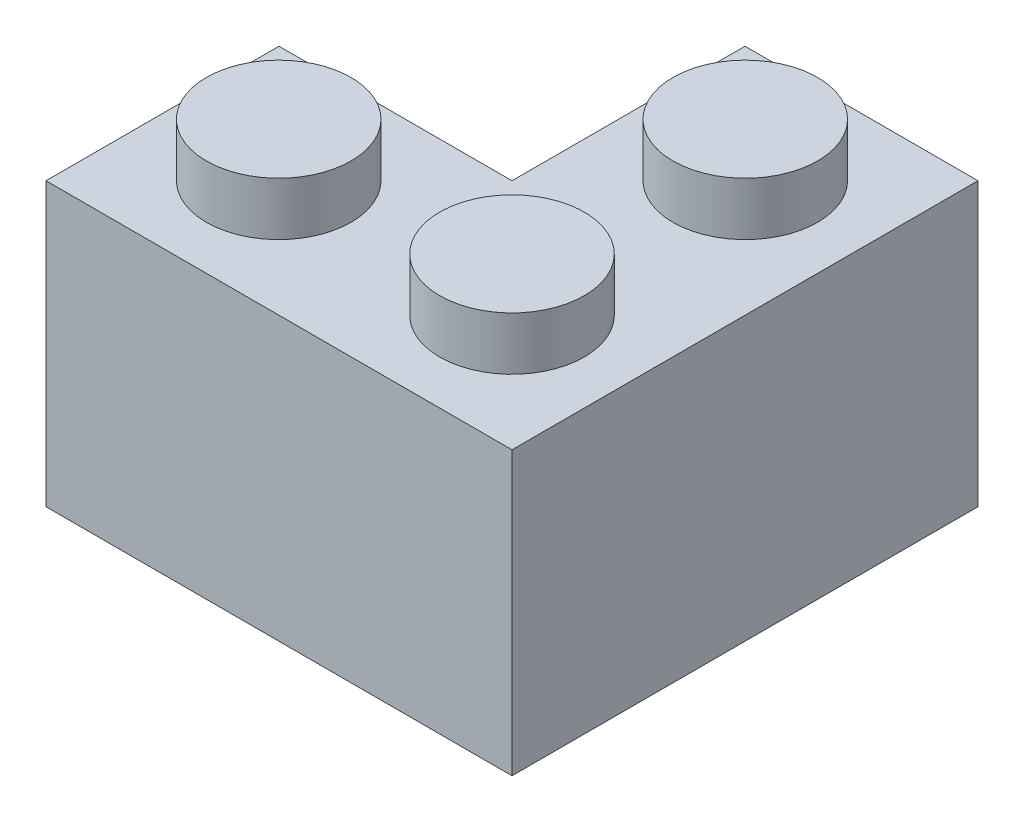
ISO-10303-21;
HEADER;
FILE_DESCRIPTION(('STEP AP214'),'2;1');
FILE_NAME('part.step','',(''),(''),'','','');
FILE_SCHEMA(('AUTOMOTIVE_DESIGN { 1 0 10303 214 1 1 1 1 }'));
ENDSEC;
DATA;
#1=APPLICATION_CONTEXT('core data for automotive mechanical design processes');
#2=APPLICATION_PROTOCOL_DEFINITION('international standard','automotive_design',2000,#1);
#3=PRODUCT_CONTEXT('',#1,'mechanical');
#4=PRODUCT('Part','Part','',(#3));
#5=PRODUCT_RELATED_PRODUCT_CATEGORY('part','',(#4));
#6=PRODUCT_DEFINITION_FORMATION('','',#4);
#7=PRODUCT_DEFINITION_CONTEXT('part definition',#1,'design');
#8=PRODUCT_DEFINITION('design','',#6,#7);
#9=PRODUCT_DEFINITION_SHAPE('','',#8);
#10=(LENGTH_UNIT() NAMED_UNIT(*) SI_UNIT(.MILLI.,.METRE.));
#11=(NAMED_UNIT(*) PLANE_ANGLE_UNIT() SI_UNIT($,.RADIAN.));
#12=(NAMED_UNIT(*) SI_UNIT($,.STERADIAN.) SOLID_ANGLE_UNIT());
#13=UNCERTAINTY_MEASURE_WITH_UNIT(LENGTH_MEASURE(1.E-05),#10,'distance_accuracy_value','');
#14=(GEOMETRIC_REPRESENTATION_CONTEXT(3) GLOBAL_UNCERTAINTY_ASSIGNED_CONTEXT((#13)) GLOBAL_UNIT_ASSIGNED_CONTEXT((#10,
#11,#12)) REPRESENTATION_CONTEXT('',''));
#15=CARTESIAN_POINT('',(0.,0.,0.));
#16=DIRECTION('',(0.,0.,1.));
#17=DIRECTION('',(1.,0.,0.));
#18=AXIS2_PLACEMENT_3D('',#15,#16,#17);
#19=CARTESIAN_POINT('',(-7.89,-9.56,0.));
#20=DIRECTION('',(0.,0.,-1.));
#21=DIRECTION('',(-1.,0.,0.));
#22=AXIS2_PLACEMENT_3D('',#19,#20,#21);
#23=PLANE('',#22);
#24=DIRECTION('',(-1.,0.,0.));
#25=VECTOR('',#24,1.);
#26=CARTESIAN_POINT('',(-7.89,0.,0.));
#27=LINE('',#26,#25);
#28=CARTESIAN_POINT('',(0.,0.,0.));
#29=VERTEX_POINT('',#28);
#30=CARTESIAN_POINT('',(-7.89,0.,0.));
#31=VERTEX_POINT('',#30);
#32=EDGE_CURVE('E135',#29,#31,#27,.T.);
#33=ORIENTED_EDGE('',*,*,#32,.F.);
#34=DIRECTION('',(0.,1.,0.));
#35=VECTOR('',#34,1.);
#36=CARTESIAN_POINT('',(0.,-9.56,0.));
#37=LINE('',#36,#35);
#38=CARTESIAN_POINT('',(0.,-9.56,0.));
#39=VERTEX_POINT('',#38);
#40=EDGE_CURVE('E58',#39,#29,#37,.T.);
#41=ORIENTED_EDGE('',*,*,#40,.F.);
#42=DIRECTION('',(-1.,0.,0.));
#43=VECTOR('',#42,1.);
#44=CARTESIAN_POINT('',(-7.89,-9.56,0.));
#45=LINE('',#44,#43);
#46=CARTESIAN_POINT('',(-7.89,-9.56,0.));
#47=VERTEX_POINT('',#46);
#48=EDGE_CURVE('E151',#39,#47,#45,.T.);
#49=ORIENTED_EDGE('',*,*,#48,.T.);
#50=DIRECTION('',(0.,1.,0.));
#51=VECTOR('',#50,1.);
#52=CARTESIAN_POINT('',(-7.89,-9.56,0.));
#53=LINE('',#52,#51);
#54=EDGE_CURVE('E91',#47,#31,#53,.T.);
#55=ORIENTED_EDGE('',*,*,#54,.T.);
#56=EDGE_LOOP('',(#33,#41,#49,#55));
#57=FACE_BOUND('',#56,.T.);
#58=ADVANCED_FACE('F35',(#57),#23,.T.);
#59=CARTESIAN_POINT('',(0.,-9.56,0.));
#60=DIRECTION('',(-1.,0.,0.));
#61=DIRECTION('',(0.,0.,1.));
#62=AXIS2_PLACEMENT_3D('',#59,#60,#61);
#63=PLANE('',#62);
#64=DIRECTION('',(0.,0.,1.));
#65=VECTOR('',#64,1.);
#66=CARTESIAN_POINT('',(0.,0.,0.));
#67=LINE('',#66,#65);
#68=CARTESIAN_POINT('',(0.,0.,-7.89));
#69=VERTEX_POINT('',#68);
#70=EDGE_CURVE('E148',#69,#29,#67,.T.);
#71=ORIENTED_EDGE('',*,*,#70,.F.);
#72=DIRECTION('',(0.,1.,0.));
#73=VECTOR('',#72,1.);
#74=CARTESIAN_POINT('',(0.,-9.56,-7.89));
#75=LINE('',#74,#73);
#76=CARTESIAN_POINT('',(0.,-9.56,-7.89));
#77=VERTEX_POINT('',#76);
#78=EDGE_CURVE('E116',#77,#69,#75,.T.);
#79=ORIENTED_EDGE('',*,*,#78,.F.);
#80=DIRECTION('',(0.,0.,1.));
#81=VECTOR('',#80,1.);
#82=CARTESIAN_POINT('',(0.,-9.56,0.));
#83=LINE('',#82,#81);
#84=EDGE_CURVE('E125',#77,#39,#83,.T.);
#85=ORIENTED_EDGE('',*,*,#84,.T.);
#86=ORIENTED_EDGE('',*,*,#40,.T.);
#87=EDGE_LOOP('',(#71,#79,#85,#86));
#88=FACE_BOUND('',#87,.T.);
#89=ADVANCED_FACE('F283',(#88),#63,.T.);
#90=CARTESIAN_POINT('',(0.,-9.56,-7.89));
#91=DIRECTION('',(0.,0.,-1.));
#92=DIRECTION('',(-1.,0.,0.));
#93=AXIS2_PLACEMENT_3D('',#90,#91,#92);
#94=PLANE('',#93);
#95=DIRECTION('',(-1.,0.,0.));
#96=VECTOR('',#95,1.);
#97=CARTESIAN_POINT('',(0.,0.,-7.89));
#98=LINE('',#97,#96);
#99=CARTESIAN_POINT('',(7.89,0.,-7.89));
#100=VERTEX_POINT('',#99);
#101=EDGE_CURVE('E111',#100,#69,#98,.T.);
#102=ORIENTED_EDGE('',*,*,#101,.F.);
#103=DIRECTION('',(0.,1.,0.));
#104=VECTOR('',#103,1.);
#105=CARTESIAN_POINT('',(7.89,-9.56,-7.89));
#106=LINE('',#105,#104);
#107=CARTESIAN_POINT('',(7.89,-9.56,-7.89));
#108=VERTEX_POINT('',#107);
#109=EDGE_CURVE('E105',#108,#100,#106,.T.);
#110=ORIENTED_EDGE('',*,*,#109,.F.);
#111=DIRECTION('',(-1.,0.,0.));
#112=VECTOR('',#111,1.);
#113=CARTESIAN_POINT('',(0.,-9.56,-7.89));
#114=LINE('',#113,#112);
#115=EDGE_CURVE('E108',#108,#77,#114,.T.);
#116=ORIENTED_EDGE('',*,*,#115,.T.);
#117=ORIENTED_EDGE('',*,*,#78,.T.);
#118=EDGE_LOOP('',(#102,#110,#116,#117));
#119=FACE_BOUND('',#118,.T.);
#120=ADVANCED_FACE('F107',(#119),#94,.T.);
#121=CARTESIAN_POINT('',(7.89,-9.56,-7.89));
#122=DIRECTION('',(1.,0.,0.));
#123=DIRECTION('',(0.,0.,-1.));
#124=AXIS2_PLACEMENT_3D('',#121,#122,#123);
#125=PLANE('',#124);
#126=DIRECTION('',(0.,0.,-1.));
#127=VECTOR('',#126,1.);
#128=CARTESIAN_POINT('',(7.89,0.,-7.89));
#129=LINE('',#128,#127);
#130=CARTESIAN_POINT('',(7.89,0.,7.89));
#131=VERTEX_POINT('',#130);
#132=EDGE_CURVE('E145',#131,#100,#129,.T.);
#133=ORIENTED_EDGE('',*,*,#132,.F.);
#134=DIRECTION('',(0.,1.,0.));
#135=VECTOR('',#134,1.);
#136=CARTESIAN_POINT('',(7.89,-9.56,7.89));
#137=LINE('',#136,#135);
#138=CARTESIAN_POINT('',(7.89,-9.56,7.89));
#139=VERTEX_POINT('',#138);
#140=EDGE_CURVE('E117',#139,#131,#137,.T.);
#141=ORIENTED_EDGE('',*,*,#140,.F.);
#142=DIRECTION('',(0.,0.,-1.));
#143=VECTOR('',#142,1.);
#144=CARTESIAN_POINT('',(7.89,-9.56,-7.89));
#145=LINE('',#144,#143);
#146=EDGE_CURVE('E123',#139,#108,#145,.T.);
#147=ORIENTED_EDGE('',*,*,#146,.T.);
#148=ORIENTED_EDGE('',*,*,#109,.T.);
#149=EDGE_LOOP('',(#133,#141,#147,#148));
#150=FACE_BOUND('',#149,.T.);
#151=ADVANCED_FACE('F127',(#150),#125,.T.);
#152=CARTESIAN_POINT('',(7.89,-9.56,7.89));
#153=DIRECTION('',(0.,0.,1.));
#154=DIRECTION('',(1.,0.,0.));
#155=AXIS2_PLACEMENT_3D('',#152,#153,#154);
#156=PLANE('',#155);
#157=DIRECTION('',(1.,0.,0.));
#158=VECTOR('',#157,1.);
#159=CARTESIAN_POINT('',(7.89,0.,7.89));
#160=LINE('',#159,#158);
#161=CARTESIAN_POINT('',(-7.89,0.,7.89));
#162=VERTEX_POINT('',#161);
#163=EDGE_CURVE('E142',#162,#131,#160,.T.);
#164=ORIENTED_EDGE('',*,*,#163,.F.);
#165=DIRECTION('',(0.,1.,0.));
#166=VECTOR('',#165,1.);
#167=CARTESIAN_POINT('',(-7.89,-9.56,7.89));
#168=LINE('',#167,#166);
#169=CARTESIAN_POINT('',(-7.89,-9.56,7.89));
#170=VERTEX_POINT('',#169);
#171=EDGE_CURVE('E155',#170,#162,#168,.T.);
#172=ORIENTED_EDGE('',*,*,#171,.F.);
#173=DIRECTION('',(1.,0.,0.));
#174=VECTOR('',#173,1.);
#175=CARTESIAN_POINT('',(7.89,-9.56,7.89));
#176=LINE('',#175,#174);
#177=EDGE_CURVE('E128',#170,#139,#176,.T.);
#178=ORIENTED_EDGE('',*,*,#177,.T.);
#179=ORIENTED_EDGE('',*,*,#140,.T.);
#180=EDGE_LOOP('',(#164,#172,#178,#179));
#181=FACE_BOUND('',#180,.T.);
#182=ADVANCED_FACE('F296',(#181),#156,.T.);
#183=CARTESIAN_POINT('',(-7.89,-9.56,7.89));
#184=DIRECTION('',(-1.,0.,0.));
#185=DIRECTION('',(0.,0.,1.));
#186=AXIS2_PLACEMENT_3D('',#183,#184,#185);
#187=PLANE('',#186);
#188=DIRECTION('',(0.,0.,1.));
#189=VECTOR('',#188,1.);
#190=CARTESIAN_POINT('',(-7.89,0.,7.89));
#191=LINE('',#190,#189);
#192=EDGE_CURVE('E138',#31,#162,#191,.T.);
#193=ORIENTED_EDGE('',*,*,#192,.F.);
#194=ORIENTED_EDGE('',*,*,#54,.F.);
#195=DIRECTION('',(0.,0.,1.));
#196=VECTOR('',#195,1.);
#197=CARTESIAN_POINT('',(-7.89,-9.56,7.89));
#198=LINE('',#197,#196);
#199=EDGE_CURVE('E130',#47,#170,#198,.T.);
#200=ORIENTED_EDGE('',*,*,#199,.T.);
#201=ORIENTED_EDGE('',*,*,#171,.T.);
#202=EDGE_LOOP('',(#193,#194,#200,#201));
#203=FACE_BOUND('',#202,.T.);
#204=ADVANCED_FACE('F279',(#203),#187,.T.);
#205=CARTESIAN_POINT('',(0.,-9.56,0.));
#206=DIRECTION('',(0.,1.,0.));
#207=DIRECTION('',(0.,0.,1.));
#208=AXIS2_PLACEMENT_3D('',#205,#206,#207);
#209=PLANE('',#208);
#210=DIRECTION('',(0.,0.,1.));
#211=VECTOR('',#210,1.);
#212=CARTESIAN_POINT('',(1.5,-9.56,0.));
#213=LINE('',#212,#211);
#214=CARTESIAN_POINT('',(1.5,-9.56,-6.39));
#215=VERTEX_POINT('',#214);
#216=CARTESIAN_POINT('',(1.5,-9.56,1.5));
#217=VERTEX_POINT('',#216);
#218=EDGE_CURVE('E250',#215,#217,#213,.T.);
#219=ORIENTED_EDGE('',*,*,#218,.T.);
#220=DIRECTION('',(-1.,0.,0.));
#221=VECTOR('',#220,1.);
#222=CARTESIAN_POINT('',(0.,-9.56,1.5));
#223=LINE('',#222,#221);
#224=CARTESIAN_POINT('',(-6.39,-9.56,1.5));
#225=VERTEX_POINT('',#224);
#226=EDGE_CURVE('E211',#217,#225,#223,.T.);
#227=ORIENTED_EDGE('',*,*,#226,.T.);
#228=DIRECTION('',(0.,0.,1.));
#229=VECTOR('',#228,1.);
#230=CARTESIAN_POINT('',(-6.39,-9.56,0.));
#231=LINE('',#230,#229);
#232=CARTESIAN_POINT('',(-6.39,-9.56,6.39));
#233=VERTEX_POINT('',#232);
#234=EDGE_CURVE('E215',#225,#233,#231,.T.);
#235=ORIENTED_EDGE('',*,*,#234,.T.);
#236=DIRECTION('',(1.,0.,0.));
#237=VECTOR('',#236,1.);
#238=CARTESIAN_POINT('',(0.,-9.56,6.39));
#239=LINE('',#238,#237);
#240=CARTESIAN_POINT('',(6.39,-9.56,6.39));
#241=VERTEX_POINT('',#240);
#242=EDGE_CURVE('E49',#233,#241,#239,.T.);
#243=ORIENTED_EDGE('',*,*,#242,.T.);
#244=DIRECTION('',(0.,0.,-1.));
#245=VECTOR('',#244,1.);
#246=CARTESIAN_POINT('',(6.39,-9.56,0.));
#247=LINE('',#246,#245);
#248=CARTESIAN_POINT('',(6.39,-9.56,-6.39));
#249=VERTEX_POINT('',#248);
#250=EDGE_CURVE('E256',#241,#249,#247,.T.);
#251=ORIENTED_EDGE('',*,*,#250,.T.);
#252=DIRECTION('',(-1.,0.,0.));
#253=VECTOR('',#252,1.);
#254=CARTESIAN_POINT('',(0.,-9.56,-6.39));
#255=LINE('',#254,#253);
#256=EDGE_CURVE('E253',#249,#215,#255,.T.);
#257=ORIENTED_EDGE('',*,*,#256,.T.);
#258=EDGE_LOOP('',(#219,#227,#235,#243,#251,#257));
#259=FACE_BOUND('',#258,.T.);
#260=ORIENTED_EDGE('',*,*,#48,.F.);
#261=ORIENTED_EDGE('',*,*,#84,.F.);
#262=ORIENTED_EDGE('',*,*,#115,.F.);
#263=ORIENTED_EDGE('',*,*,#146,.F.);
#264=ORIENTED_EDGE('',*,*,#177,.F.);
#265=ORIENTED_EDGE('',*,*,#199,.F.);
#266=EDGE_LOOP('',(#260,#261,#262,#263,#264,#265));
#267=FACE_BOUND('',#266,.T.);
#268=ADVANCED_FACE('F121',(#259,#267),#209,.F.);
#269=CARTESIAN_POINT('',(0.,0.,0.));
#270=DIRECTION('',(0.,1.,0.));
#271=DIRECTION('',(0.,0.,1.));
#272=AXIS2_PLACEMENT_3D('',#269,#270,#271);
#273=PLANE('',#272);
#274=CARTESIAN_POINT('',(-3.955,0.,3.945));
#275=DIRECTION('',(0.,1.,0.));
#276=DIRECTION('',(0.,0.,1.));
#277=AXIS2_PLACEMENT_3D('',#274,#275,#276);
#278=CIRCLE('',#277,2.45);
#279=CARTESIAN_POINT('',(-3.955,0.,6.395));
#280=VERTEX_POINT('',#279);
#281=EDGE_CURVE('E266',#280,#280,#278,.T.);
#282=ORIENTED_EDGE('',*,*,#281,.F.);
#283=EDGE_LOOP('',(#282));
#284=FACE_BOUND('',#283,.T.);
#285=CARTESIAN_POINT('',(3.945,0.,-3.955));
#286=DIRECTION('',(0.,1.,0.));
#287=DIRECTION('',(0.,0.,1.));
#288=AXIS2_PLACEMENT_3D('',#285,#286,#287);
#289=CIRCLE('',#288,2.45);
#290=CARTESIAN_POINT('',(3.945,0.,-1.505));
#291=VERTEX_POINT('',#290);
#292=EDGE_CURVE('E265',#291,#291,#289,.T.);
#293=ORIENTED_EDGE('',*,*,#292,.F.);
#294=EDGE_LOOP('',(#293));
#295=FACE_BOUND('',#294,.T.);
#296=CARTESIAN_POINT('',(3.945,0.,3.945));
#297=DIRECTION('',(0.,1.,0.));
#298=DIRECTION('',(0.,0.,1.));
#299=AXIS2_PLACEMENT_3D('',#296,#297,#298);
#300=CIRCLE('',#299,2.45);
#301=CARTESIAN_POINT('',(3.945,0.,6.395));
#302=VERTEX_POINT('',#301);
#303=EDGE_CURVE('E272',#302,#302,#300,.T.);
#304=ORIENTED_EDGE('',*,*,#303,.F.);
#305=EDGE_LOOP('',(#304));
#306=FACE_BOUND('',#305,.T.);
#307=ORIENTED_EDGE('',*,*,#32,.T.);
#308=ORIENTED_EDGE('',*,*,#192,.T.);
#309=ORIENTED_EDGE('',*,*,#163,.T.);
#310=ORIENTED_EDGE('',*,*,#132,.T.);
#311=ORIENTED_EDGE('',*,*,#101,.T.);
#312=ORIENTED_EDGE('',*,*,#70,.T.);
#313=EDGE_LOOP('',(#307,#308,#309,#310,#311,#312));
#314=FACE_BOUND('',#313,.T.);
#315=ADVANCED_FACE('F282',(#284,#295,#306,#314),#273,.T.);
#316=CARTESIAN_POINT('',(3.945,1.8,3.945));
#317=DIRECTION('',(0.,-1.,0.));
#318=DIRECTION('',(0.,0.,-1.));
#319=AXIS2_PLACEMENT_3D('',#316,#317,#318);
#320=CYLINDRICAL_SURFACE('',#319,2.45);
#321=CARTESIAN_POINT('',(3.945,1.8,3.945));
#322=DIRECTION('',(0.,1.,0.));
#323=DIRECTION('',(0.,0.,1.));
#324=AXIS2_PLACEMENT_3D('',#321,#322,#323);
#325=CIRCLE('',#324,2.45);
#326=CARTESIAN_POINT('',(3.945,1.8,6.395));
#327=VERTEX_POINT('',#326);
#328=EDGE_CURVE('E139',#327,#327,#325,.T.);
#329=ORIENTED_EDGE('',*,*,#328,.F.);
#330=EDGE_LOOP('',(#329));
#331=FACE_BOUND('',#330,.T.);
#332=ORIENTED_EDGE('',*,*,#303,.T.);
#333=EDGE_LOOP('',(#332));
#334=FACE_BOUND('',#333,.T.);
#335=ADVANCED_FACE('F307',(#331,#334),#320,.T.);
#336=CARTESIAN_POINT('',(3.945,1.8,3.945));
#337=DIRECTION('',(0.,1.,0.));
#338=DIRECTION('',(0.,0.,1.));
#339=AXIS2_PLACEMENT_3D('',#336,#337,#338);
#340=PLANE('',#339);
#341=ORIENTED_EDGE('',*,*,#328,.T.);
#342=EDGE_LOOP('',(#341));
#343=FACE_BOUND('',#342,.T.);
#344=ADVANCED_FACE('F312',(#343),#340,.T.);
#345=CARTESIAN_POINT('',(3.945,1.8,-3.955));
#346=DIRECTION('',(0.,-1.,0.));
#347=DIRECTION('',(0.,0.,-1.));
#348=AXIS2_PLACEMENT_3D('',#345,#346,#347);
#349=CYLINDRICAL_SURFACE('',#348,2.45);
#350=CARTESIAN_POINT('',(3.945,1.8,-3.955));
#351=DIRECTION('',(0.,1.,0.));
#352=DIRECTION('',(0.,0.,1.));
#353=AXIS2_PLACEMENT_3D('',#350,#351,#352);
#354=CIRCLE('',#353,2.45);
#355=CARTESIAN_POINT('',(3.945,1.8,-1.505));
#356=VERTEX_POINT('',#355);
#357=EDGE_CURVE('E269',#356,#356,#354,.T.);
#358=ORIENTED_EDGE('',*,*,#357,.F.);
#359=EDGE_LOOP('',(#358));
#360=FACE_BOUND('',#359,.T.);
#361=ORIENTED_EDGE('',*,*,#292,.T.);
#362=EDGE_LOOP('',(#361));
#363=FACE_BOUND('',#362,.T.);
#364=ADVANCED_FACE('F316',(#360,#363),#349,.T.);
#365=CARTESIAN_POINT('',(3.945,1.8,-3.955));
#366=DIRECTION('',(0.,1.,0.));
#367=DIRECTION('',(0.,0.,1.));
#368=AXIS2_PLACEMENT_3D('',#365,#366,#367);
#369=PLANE('',#368);
#370=ORIENTED_EDGE('',*,*,#357,.T.);
#371=EDGE_LOOP('',(#370));
#372=FACE_BOUND('',#371,.T.);
#373=ADVANCED_FACE('F320',(#372),#369,.T.);
#374=CARTESIAN_POINT('',(-3.955,1.8,3.945));
#375=DIRECTION('',(0.,-1.,0.));
#376=DIRECTION('',(0.,0.,-1.));
#377=AXIS2_PLACEMENT_3D('',#374,#375,#376);
#378=CYLINDRICAL_SURFACE('',#377,2.45);
#379=CARTESIAN_POINT('',(-3.955,1.8,3.945));
#380=DIRECTION('',(0.,1.,0.));
#381=DIRECTION('',(0.,0.,1.));
#382=AXIS2_PLACEMENT_3D('',#379,#380,#381);
#383=CIRCLE('',#382,2.45);
#384=CARTESIAN_POINT('',(-3.955,1.8,6.395));
#385=VERTEX_POINT('',#384);
#386=EDGE_CURVE('E262',#385,#385,#383,.T.);
#387=ORIENTED_EDGE('',*,*,#386,.F.);
#388=EDGE_LOOP('',(#387));
#389=FACE_BOUND('',#388,.T.);
#390=ORIENTED_EDGE('',*,*,#281,.T.);
#391=EDGE_LOOP('',(#390));
#392=FACE_BOUND('',#391,.T.);
#393=ADVANCED_FACE('F324',(#389,#392),#378,.T.);
#394=CARTESIAN_POINT('',(-3.955,1.8,3.945));
#395=DIRECTION('',(0.,1.,0.));
#396=DIRECTION('',(0.,0.,1.));
#397=AXIS2_PLACEMENT_3D('',#394,#395,#396);
#398=PLANE('',#397);
#399=ORIENTED_EDGE('',*,*,#386,.T.);
#400=EDGE_LOOP('',(#399));
#401=FACE_BOUND('',#400,.T.);
#402=ADVANCED_FACE('F328',(#401),#398,.T.);
#403=CARTESIAN_POINT('',(-7.89,-9.56,1.5));
#404=DIRECTION('',(0.,0.,-1.));
#405=DIRECTION('',(-1.,0.,0.));
#406=AXIS2_PLACEMENT_3D('',#403,#404,#405);
#407=PLANE('',#406);
#408=DIRECTION('',(-1.,0.,0.));
#409=VECTOR('',#408,1.);
#410=CARTESIAN_POINT('',(0.,-1.5,1.5));
#411=LINE('',#410,#409);
#412=CARTESIAN_POINT('',(1.5,-1.5,1.5));
#413=VERTEX_POINT('',#412);
#414=CARTESIAN_POINT('',(-6.39,-1.5,1.5));
#415=VERTEX_POINT('',#414);
#416=EDGE_CURVE('E186',#413,#415,#411,.T.);
#417=ORIENTED_EDGE('',*,*,#416,.T.);
#418=DIRECTION('',(0.,1.,0.));
#419=VECTOR('',#418,1.);
#420=CARTESIAN_POINT('',(-6.39,-9.56,1.5));
#421=LINE('',#420,#419);
#422=EDGE_CURVE('E221',#225,#415,#421,.T.);
#423=ORIENTED_EDGE('',*,*,#422,.F.);
#424=ORIENTED_EDGE('',*,*,#226,.F.);
#425=DIRECTION('',(0.,1.,0.));
#426=VECTOR('',#425,1.);
#427=CARTESIAN_POINT('',(1.5,-9.56,1.5));
#428=LINE('',#427,#426);
#429=EDGE_CURVE('E206',#217,#413,#428,.T.);
#430=ORIENTED_EDGE('',*,*,#429,.T.);
#431=EDGE_LOOP('',(#417,#423,#424,#430));
#432=FACE_BOUND('',#431,.T.);
#433=ADVANCED_FACE('F332',(#432),#407,.F.);
#434=CARTESIAN_POINT('',(1.5,-9.56,0.));
#435=DIRECTION('',(-1.,0.,0.));
#436=DIRECTION('',(0.,0.,1.));
#437=AXIS2_PLACEMENT_3D('',#434,#435,#436);
#438=PLANE('',#437);
#439=DIRECTION('',(0.,0.,1.));
#440=VECTOR('',#439,1.);
#441=CARTESIAN_POINT('',(1.5,-1.5,0.));
#442=LINE('',#441,#440);
#443=CARTESIAN_POINT('',(1.5,-1.5,-6.39));
#444=VERTEX_POINT('',#443);
#445=EDGE_CURVE('E190',#444,#413,#442,.T.);
#446=ORIENTED_EDGE('',*,*,#445,.T.);
#447=ORIENTED_EDGE('',*,*,#429,.F.);
#448=ORIENTED_EDGE('',*,*,#218,.F.);
#449=DIRECTION('',(0.,1.,0.));
#450=VECTOR('',#449,1.);
#451=CARTESIAN_POINT('',(1.5,-9.56,-6.39));
#452=LINE('',#451,#450);
#453=EDGE_CURVE('E209',#215,#444,#452,.T.);
#454=ORIENTED_EDGE('',*,*,#453,.T.);
#455=EDGE_LOOP('',(#446,#447,#448,#454));
#456=FACE_BOUND('',#455,.T.);
#457=ADVANCED_FACE('F204',(#456),#438,.F.);
#458=CARTESIAN_POINT('',(0.,-9.56,-6.39));
#459=DIRECTION('',(0.,0.,-1.));
#460=DIRECTION('',(-1.,0.,0.));
#461=AXIS2_PLACEMENT_3D('',#458,#459,#460);
#462=PLANE('',#461);
#463=DIRECTION('',(-1.,0.,0.));
#464=VECTOR('',#463,1.);
#465=CARTESIAN_POINT('',(0.,-1.5,-6.39));
#466=LINE('',#465,#464);
#467=CARTESIAN_POINT('',(6.39,-1.5,-6.39));
#468=VERTEX_POINT('',#467);
#469=EDGE_CURVE('E212',#468,#444,#466,.T.);
#470=ORIENTED_EDGE('',*,*,#469,.T.);
#471=ORIENTED_EDGE('',*,*,#453,.F.);
#472=ORIENTED_EDGE('',*,*,#256,.F.);
#473=DIRECTION('',(0.,1.,0.));
#474=VECTOR('',#473,1.);
#475=CARTESIAN_POINT('',(6.39,-9.56,-6.39));
#476=LINE('',#475,#474);
#477=EDGE_CURVE('E223',#249,#468,#476,.T.);
#478=ORIENTED_EDGE('',*,*,#477,.T.);
#479=EDGE_LOOP('',(#470,#471,#472,#478));
#480=FACE_BOUND('',#479,.T.);
#481=ADVANCED_FACE('F366',(#480),#462,.F.);
#482=CARTESIAN_POINT('',(6.39,-9.56,-7.89));
#483=DIRECTION('',(1.,0.,0.));
#484=DIRECTION('',(0.,0.,-1.));
#485=AXIS2_PLACEMENT_3D('',#482,#483,#484);
#486=PLANE('',#485);
#487=DIRECTION('',(0.,0.,-1.));
#488=VECTOR('',#487,1.);
#489=CARTESIAN_POINT('',(6.39,-1.5,0.));
#490=LINE('',#489,#488);
#491=CARTESIAN_POINT('',(6.39,-1.5,6.39));
#492=VERTEX_POINT('',#491);
#493=EDGE_CURVE('E217',#492,#468,#490,.T.);
#494=ORIENTED_EDGE('',*,*,#493,.T.);
#495=ORIENTED_EDGE('',*,*,#477,.F.);
#496=ORIENTED_EDGE('',*,*,#250,.F.);
#497=DIRECTION('',(0.,1.,0.));
#498=VECTOR('',#497,1.);
#499=CARTESIAN_POINT('',(6.39,-9.56,6.39));
#500=LINE('',#499,#498);
#501=EDGE_CURVE('E227',#241,#492,#500,.T.);
#502=ORIENTED_EDGE('',*,*,#501,.T.);
#503=EDGE_LOOP('',(#494,#495,#496,#502));
#504=FACE_BOUND('',#503,.T.);
#505=ADVANCED_FACE('F363',(#504),#486,.F.);
#506=CARTESIAN_POINT('',(7.89,-9.56,6.39));
#507=DIRECTION('',(0.,0.,1.));
#508=DIRECTION('',(1.,0.,0.));
#509=AXIS2_PLACEMENT_3D('',#506,#507,#508);
#510=PLANE('',#509);
#511=DIRECTION('',(1.,0.,0.));
#512=VECTOR('',#511,1.);
#513=CARTESIAN_POINT('',(0.,-1.5,6.39));
#514=LINE('',#513,#512);
#515=CARTESIAN_POINT('',(-6.39,-1.5,6.39));
#516=VERTEX_POINT('',#515);
#517=EDGE_CURVE('E230',#516,#492,#514,.T.);
#518=ORIENTED_EDGE('',*,*,#517,.T.);
#519=ORIENTED_EDGE('',*,*,#501,.F.);
#520=ORIENTED_EDGE('',*,*,#242,.F.);
#521=DIRECTION('',(0.,1.,0.));
#522=VECTOR('',#521,1.);
#523=CARTESIAN_POINT('',(-6.39,-9.56,6.39));
#524=LINE('',#523,#522);
#525=EDGE_CURVE('E233',#233,#516,#524,.T.);
#526=ORIENTED_EDGE('',*,*,#525,.T.);
#527=EDGE_LOOP('',(#518,#519,#520,#526));
#528=FACE_BOUND('',#527,.T.);
#529=ADVANCED_FACE('F359',(#528),#510,.F.);
#530=CARTESIAN_POINT('',(-6.39,-9.56,7.89));
#531=DIRECTION('',(-1.,0.,0.));
#532=DIRECTION('',(0.,0.,1.));
#533=AXIS2_PLACEMENT_3D('',#530,#531,#532);
#534=PLANE('',#533);
#535=DIRECTION('',(0.,0.,1.));
#536=VECTOR('',#535,1.);
#537=CARTESIAN_POINT('',(-6.39,-1.5,0.));
#538=LINE('',#537,#536);
#539=EDGE_CURVE('E194',#415,#516,#538,.T.);
#540=ORIENTED_EDGE('',*,*,#539,.T.);
#541=ORIENTED_EDGE('',*,*,#525,.F.);
#542=ORIENTED_EDGE('',*,*,#234,.F.);
#543=ORIENTED_EDGE('',*,*,#422,.T.);
#544=EDGE_LOOP('',(#540,#541,#542,#543));
#545=FACE_BOUND('',#544,.T.);
#546=ADVANCED_FACE('F166',(#545),#534,.F.);
#547=CARTESIAN_POINT('',(0.,-1.5,0.));
#548=DIRECTION('',(0.,1.,0.));
#549=DIRECTION('',(0.,0.,1.));
#550=AXIS2_PLACEMENT_3D('',#547,#548,#549);
#551=PLANE('',#550);
#552=CARTESIAN_POINT('',(3.945,-1.5,0.));
#553=DIRECTION('',(0.,1.,0.));
#554=DIRECTION('',(0.,0.,1.));
#555=AXIS2_PLACEMENT_3D('',#552,#553,#554);
#556=CIRCLE('',#555,1.48);
#557=CARTESIAN_POINT('',(3.945,-1.5,1.48));
#558=VERTEX_POINT('',#557);
#559=EDGE_CURVE('E12',#558,#558,#556,.F.);
#560=ORIENTED_EDGE('',*,*,#559,.F.);
#561=EDGE_LOOP('',(#560));
#562=FACE_BOUND('',#561,.T.);
#563=CARTESIAN_POINT('',(0.,-1.5,3.945));
#564=DIRECTION('',(0.,1.,0.));
#565=DIRECTION('',(0.,0.,1.));
#566=AXIS2_PLACEMENT_3D('',#563,#564,#565);
#567=CIRCLE('',#566,1.48);
#568=CARTESIAN_POINT('',(0.,-1.5,5.425));
#569=VERTEX_POINT('',#568);
#570=EDGE_CURVE('E42',#569,#569,#567,.F.);
#571=ORIENTED_EDGE('',*,*,#570,.F.);
#572=EDGE_LOOP('',(#571));
#573=FACE_BOUND('',#572,.T.);
#574=CARTESIAN_POINT('',(-3.955,-1.5,3.945));
#575=DIRECTION('',(0.,1.,0.));
#576=DIRECTION('',(0.,0.,1.));
#577=AXIS2_PLACEMENT_3D('',#574,#575,#576);
#578=CIRCLE('',#577,0.950000000000001);
#579=CARTESIAN_POINT('',(-3.955,-1.5,4.895));
#580=VERTEX_POINT('',#579);
#581=EDGE_CURVE('E172',#580,#580,#578,.T.);
#582=ORIENTED_EDGE('',*,*,#581,.T.);
#583=EDGE_LOOP('',(#582));
#584=FACE_BOUND('',#583,.T.);
#585=CARTESIAN_POINT('',(3.945,-1.5,-3.955));
#586=DIRECTION('',(0.,1.,0.));
#587=DIRECTION('',(0.,0.,1.));
#588=AXIS2_PLACEMENT_3D('',#585,#586,#587);
#589=CIRCLE('',#588,0.95);
#590=CARTESIAN_POINT('',(3.945,-1.5,-3.005));
#591=VERTEX_POINT('',#590);
#592=EDGE_CURVE('E176',#591,#591,#589,.T.);
#593=ORIENTED_EDGE('',*,*,#592,.T.);
#594=EDGE_LOOP('',(#593));
#595=FACE_BOUND('',#594,.T.);
#596=CARTESIAN_POINT('',(3.945,-1.5,3.945));
#597=DIRECTION('',(0.,1.,0.));
#598=DIRECTION('',(0.,0.,1.));
#599=AXIS2_PLACEMENT_3D('',#596,#597,#598);
#600=CIRCLE('',#599,0.950000000000001);
#601=CARTESIAN_POINT('',(3.945,-1.5,4.895));
#602=VERTEX_POINT('',#601);
#603=EDGE_CURVE('E180',#602,#602,#600,.T.);
#604=ORIENTED_EDGE('',*,*,#603,.T.);
#605=EDGE_LOOP('',(#604));
#606=FACE_BOUND('',#605,.T.);
#607=ORIENTED_EDGE('',*,*,#416,.F.);
#608=ORIENTED_EDGE('',*,*,#445,.F.);
#609=ORIENTED_EDGE('',*,*,#469,.F.);
#610=ORIENTED_EDGE('',*,*,#493,.F.);
#611=ORIENTED_EDGE('',*,*,#517,.F.);
#612=ORIENTED_EDGE('',*,*,#539,.F.);
#613=EDGE_LOOP('',(#607,#608,#609,#610,#611,#612));
#614=FACE_BOUND('',#613,.T.);
#615=ADVANCED_FACE('F162',(#562,#573,#584,#595,#606,#614),#551,.F.);
#616=CARTESIAN_POINT('',(3.945,1.8,3.945));
#617=DIRECTION('',(0.,-1.,0.));
#618=DIRECTION('',(0.,0.,-1.));
#619=AXIS2_PLACEMENT_3D('',#616,#617,#618);
#620=CYLINDRICAL_SURFACE('',#619,0.950000000000001);
#621=CARTESIAN_POINT('',(3.945,0.299999999999999,3.945));
#622=DIRECTION('',(0.,1.,0.));
#623=DIRECTION('',(0.,0.,1.));
#624=AXIS2_PLACEMENT_3D('',#621,#622,#623);
#625=CIRCLE('',#624,0.950000000000001);
#626=CARTESIAN_POINT('',(3.945,0.299999999999999,4.895));
#627=VERTEX_POINT('',#626);
#628=EDGE_CURVE('E199',#627,#627,#625,.T.);
#629=ORIENTED_EDGE('',*,*,#628,.T.);
#630=EDGE_LOOP('',(#629));
#631=FACE_BOUND('',#630,.T.);
#632=ORIENTED_EDGE('',*,*,#603,.F.);
#633=EDGE_LOOP('',(#632));
#634=FACE_BOUND('',#633,.T.);
#635=ADVANCED_FACE('F165',(#631,#634),#620,.F.);
#636=CARTESIAN_POINT('',(3.945,0.299999999999999,3.945));
#637=DIRECTION('',(0.,1.,0.));
#638=DIRECTION('',(0.,0.,1.));
#639=AXIS2_PLACEMENT_3D('',#636,#637,#638);
#640=PLANE('',#639);
#641=ORIENTED_EDGE('',*,*,#628,.F.);
#642=EDGE_LOOP('',(#641));
#643=FACE_BOUND('',#642,.T.);
#644=ADVANCED_FACE('F349',(#643),#640,.F.);
#645=CARTESIAN_POINT('',(3.945,1.8,-3.955));
#646=DIRECTION('',(0.,-1.,0.));
#647=DIRECTION('',(0.,0.,-1.));
#648=AXIS2_PLACEMENT_3D('',#645,#646,#647);
#649=CYLINDRICAL_SURFACE('',#648,0.95);
#650=CARTESIAN_POINT('',(3.945,0.299999999999999,-3.955));
#651=DIRECTION('',(0.,1.,0.));
#652=DIRECTION('',(0.,0.,1.));
#653=AXIS2_PLACEMENT_3D('',#650,#651,#652);
#654=CIRCLE('',#653,0.95);
#655=CARTESIAN_POINT('',(3.945,0.299999999999999,-3.005));
#656=VERTEX_POINT('',#655);
#657=EDGE_CURVE('E242',#656,#656,#654,.T.);
#658=ORIENTED_EDGE('',*,*,#657,.T.);
#659=EDGE_LOOP('',(#658));
#660=FACE_BOUND('',#659,.T.);
#661=ORIENTED_EDGE('',*,*,#592,.F.);
#662=EDGE_LOOP('',(#661));
#663=FACE_BOUND('',#662,.T.);
#664=ADVANCED_FACE('F345',(#660,#663),#649,.F.);
#665=CARTESIAN_POINT('',(3.945,0.299999999999999,-3.955));
#666=DIRECTION('',(0.,1.,0.));
#667=DIRECTION('',(0.,0.,1.));
#668=AXIS2_PLACEMENT_3D('',#665,#666,#667);
#669=PLANE('',#668);
#670=ORIENTED_EDGE('',*,*,#657,.F.);
#671=EDGE_LOOP('',(#670));
#672=FACE_BOUND('',#671,.T.);
#673=ADVANCED_FACE('F341',(#672),#669,.F.);
#674=CARTESIAN_POINT('',(-3.955,1.8,3.945));
#675=DIRECTION('',(0.,-1.,0.));
#676=DIRECTION('',(0.,0.,-1.));
#677=AXIS2_PLACEMENT_3D('',#674,#675,#676);
#678=CYLINDRICAL_SURFACE('',#677,0.950000000000001);
#679=CARTESIAN_POINT('',(-3.955,0.299999999999999,3.945));
#680=DIRECTION('',(0.,1.,0.));
#681=DIRECTION('',(0.,0.,1.));
#682=AXIS2_PLACEMENT_3D('',#679,#680,#681);
#683=CIRCLE('',#682,0.950000000000001);
#684=CARTESIAN_POINT('',(-3.955,0.299999999999999,4.895));
#685=VERTEX_POINT('',#684);
#686=EDGE_CURVE('E239',#685,#685,#683,.T.);
#687=ORIENTED_EDGE('',*,*,#686,.T.);
#688=EDGE_LOOP('',(#687));
#689=FACE_BOUND('',#688,.T.);
#690=ORIENTED_EDGE('',*,*,#581,.F.);
#691=EDGE_LOOP('',(#690));
#692=FACE_BOUND('',#691,.T.);
#693=ADVANCED_FACE('F337',(#689,#692),#678,.F.);
#694=CARTESIAN_POINT('',(-3.955,0.299999999999999,3.945));
#695=DIRECTION('',(0.,1.,0.));
#696=DIRECTION('',(0.,0.,1.));
#697=AXIS2_PLACEMENT_3D('',#694,#695,#696);
#698=PLANE('',#697);
#699=ORIENTED_EDGE('',*,*,#686,.F.);
#700=EDGE_LOOP('',(#699));
#701=FACE_BOUND('',#700,.T.);
#702=ADVANCED_FACE('F334',(#701),#698,.F.);
#703=CARTESIAN_POINT('',(0.,-13.7460721446244,3.945));
#704=DIRECTION('',(0.,1.,0.));
#705=DIRECTION('',(0.,0.,1.));
#706=AXIS2_PLACEMENT_3D('',#703,#704,#705);
#707=CYLINDRICAL_SURFACE('',#706,1.48);
#708=CARTESIAN_POINT('',(0.,-9.36,3.945));
#709=DIRECTION('',(0.,1.,0.));
#710=DIRECTION('',(0.,0.,1.));
#711=AXIS2_PLACEMENT_3D('',#708,#709,#710);
#712=CIRCLE('',#711,1.48);
#713=CARTESIAN_POINT('',(0.,-9.36,5.425));
#714=VERTEX_POINT('',#713);
#715=EDGE_CURVE('E240',#714,#714,#712,.T.);
#716=ORIENTED_EDGE('',*,*,#715,.T.);
#717=EDGE_LOOP('',(#716));
#718=FACE_BOUND('',#717,.T.);
#719=ORIENTED_EDGE('',*,*,#570,.T.);
#720=EDGE_LOOP('',(#719));
#721=FACE_BOUND('',#720,.T.);
#722=ADVANCED_FACE('F160',(#718,#721),#707,.T.);
#723=CARTESIAN_POINT('',(0.,-9.36,0.));
#724=DIRECTION('',(0.,1.,0.));
#725=DIRECTION('',(0.,0.,1.));
#726=AXIS2_PLACEMENT_3D('',#723,#724,#725);
#727=PLANE('',#726);
#728=ORIENTED_EDGE('',*,*,#715,.F.);
#729=EDGE_LOOP('',(#728));
#730=FACE_BOUND('',#729,.T.);
#731=ADVANCED_FACE('F377',(#730),#727,.F.);
#732=CARTESIAN_POINT('',(3.945,-13.7460721446244,0.));
#733=DIRECTION('',(0.,1.,0.));
#734=DIRECTION('',(0.,0.,1.));
#735=AXIS2_PLACEMENT_3D('',#732,#733,#734);
#736=CYLINDRICAL_SURFACE('',#735,1.48);
#737=CARTESIAN_POINT('',(3.945,-9.36,0.));
#738=DIRECTION('',(0.,1.,0.));
#739=DIRECTION('',(0.,0.,1.));
#740=AXIS2_PLACEMENT_3D('',#737,#738,#739);
#741=CIRCLE('',#740,1.48);
#742=CARTESIAN_POINT('',(3.945,-9.36,1.48));
#743=VERTEX_POINT('',#742);
#744=EDGE_CURVE('E393',#743,#743,#741,.T.);
#745=ORIENTED_EDGE('',*,*,#744,.T.);
#746=EDGE_LOOP('',(#745));
#747=FACE_BOUND('',#746,.T.);
#748=ORIENTED_EDGE('',*,*,#559,.T.);
#749=EDGE_LOOP('',(#748));
#750=FACE_BOUND('',#749,.T.);
#751=ADVANCED_FACE('F381',(#747,#750),#736,.T.);
#752=CARTESIAN_POINT('',(0.,-9.36,0.));
#753=DIRECTION('',(0.,1.,0.));
#754=DIRECTION('',(0.,0.,1.));
#755=AXIS2_PLACEMENT_3D('',#752,#753,#754);
#756=PLANE('',#755);
#757=ORIENTED_EDGE('',*,*,#744,.F.);
#758=EDGE_LOOP('',(#757));
#759=FACE_BOUND('',#758,.T.);
#760=ADVANCED_FACE('F385',(#759),#756,.F.);
#761=CLOSED_SHELL('',(#58,#89,#120,#151,#182,#204,#268,#315,#335,#344,#364,#373,#393,#402,#433,
#457,#481,#505,#529,#546,#615,#635,#644,#664,#673,#693,#702,#722,#731,#751,#760));
#762=MANIFOLD_SOLID_BREP('B2',#761);
#763=ADVANCED_BREP_SHAPE_REPRESENTATION('',(#18,#762),#14);
#764=SHAPE_DEFINITION_REPRESENTATION(#9,#763);
ENDSEC;
END-ISO-10303-21;
